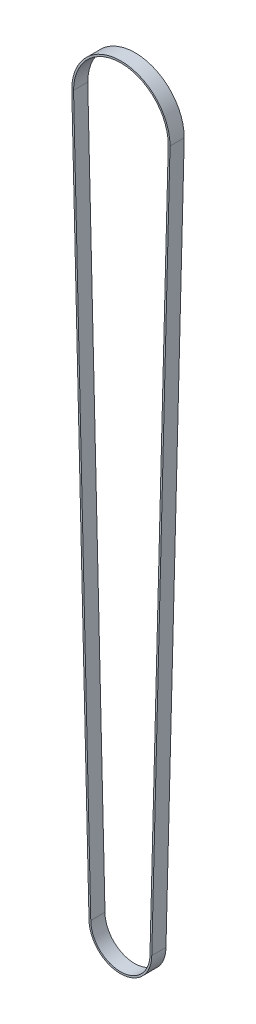
ISO-10303-21;
HEADER;
FILE_DESCRIPTION(('STEP AP214'),'2;1');
FILE_NAME('part.step','',(''),(''),'','','');
FILE_SCHEMA(('AUTOMOTIVE_DESIGN { 1 0 10303 214 1 1 1 1 }'));
ENDSEC;
DATA;
#1=APPLICATION_CONTEXT('core data for automotive mechanical design processes');
#2=APPLICATION_PROTOCOL_DEFINITION('international standard','automotive_design',2000,#1);
#3=PRODUCT_CONTEXT('',#1,'mechanical');
#4=PRODUCT('Part','Part','',(#3));
#5=PRODUCT_RELATED_PRODUCT_CATEGORY('part','',(#4));
#6=PRODUCT_DEFINITION_FORMATION('','',#4);
#7=PRODUCT_DEFINITION_CONTEXT('part definition',#1,'design');
#8=PRODUCT_DEFINITION('design','',#6,#7);
#9=PRODUCT_DEFINITION_SHAPE('','',#8);
#10=(LENGTH_UNIT() NAMED_UNIT(*) SI_UNIT(.MILLI.,.METRE.));
#11=(NAMED_UNIT(*) PLANE_ANGLE_UNIT() SI_UNIT($,.RADIAN.));
#12=(NAMED_UNIT(*) SI_UNIT($,.STERADIAN.) SOLID_ANGLE_UNIT());
#13=UNCERTAINTY_MEASURE_WITH_UNIT(LENGTH_MEASURE(1.E-05),#10,'distance_accuracy_value','');
#14=(GEOMETRIC_REPRESENTATION_CONTEXT(3) GLOBAL_UNCERTAINTY_ASSIGNED_CONTEXT((#13)) GLOBAL_UNIT_ASSIGNED_CONTEXT((#10,
#11,#12)) REPRESENTATION_CONTEXT('',''));
#15=CARTESIAN_POINT('',(0.,0.,0.));
#16=DIRECTION('',(0.,0.,1.));
#17=DIRECTION('',(1.,0.,0.));
#18=AXIS2_PLACEMENT_3D('',#15,#16,#17);
#19=CARTESIAN_POINT('',(-148.027890657385,409.394228907631,6.));
#20=DIRECTION('',(0.,0.,-1.));
#21=DIRECTION('',(-1.,0.,0.));
#22=AXIS2_PLACEMENT_3D('',#19,#20,#21);
#23=PLANE('',#22);
#24=CARTESIAN_POINT('',(-148.027890657385,409.394228907631,6.));
#25=DIRECTION('',(0.,0.,1.));
#26=DIRECTION('',(-1.,0.,0.));
#27=AXIS2_PLACEMENT_3D('',#24,#25,#26);
#28=CIRCLE('',#27,20.75);
#29=CARTESIAN_POINT('',(-127.277892941837,409.384492134822,6.));
#30=VERTEX_POINT('',#29);
#31=CARTESIAN_POINT('',(-168.777888625479,409.385046093184,6.));
#32=VERTEX_POINT('',#31);
#33=EDGE_CURVE('E140',#30,#32,#28,.T.);
#34=ORIENTED_EDGE('',*,*,#33,.T.);
#35=DIRECTION('',(0.0242606584120572,-0.999705666910723,0.));
#36=VECTOR('',#35,1.);
#37=CARTESIAN_POINT('',(-168.777888625479,409.385046093184,6.));
#38=LINE('',#37,#36);
#39=CARTESIAN_POINT('',(-161.497547072751,109.384997302637,6.));
#40=VERTEX_POINT('',#39);
#41=EDGE_CURVE('E143',#32,#40,#38,.T.);
#42=ORIENTED_EDGE('',*,*,#41,.T.);
#43=CARTESIAN_POINT('',(-148.247550288696,109.394228907631,6.));
#44=DIRECTION('',(0.,0.,1.));
#45=DIRECTION('',(-1.,0.,0.));
#46=AXIS2_PLACEMENT_3D('',#43,#44,#45);
#47=CIRCLE('',#46,13.25);
#48=CARTESIAN_POINT('',(-134.997553506784,109.38499422727,6.));
#49=VERTEX_POINT('',#48);
#50=EDGE_CURVE('E146',#40,#49,#47,.T.);
#51=ORIENTED_EDGE('',*,*,#50,.T.);
#52=DIRECTION('',(0.0257237298953508,0.999669090109458,0.));
#53=VECTOR('',#52,1.);
#54=CARTESIAN_POINT('',(-134.997553506784,109.38499422727,6.));
#55=LINE('',#54,#53);
#56=EDGE_CURVE('E148',#49,#30,#55,.T.);
#57=ORIENTED_EDGE('',*,*,#56,.T.);
#58=EDGE_LOOP('',(#34,#42,#51,#57));
#59=FACE_BOUND('',#58,.T.);
#60=CARTESIAN_POINT('',(-148.027890657385,409.394228907631,6.));
#61=DIRECTION('',(0.,0.,1.));
#62=DIRECTION('',(-1.,0.,0.));
#63=AXIS2_PLACEMENT_3D('',#60,#61,#62);
#64=CIRCLE('',#63,20.);
#65=CARTESIAN_POINT('',(-128.027890657385,409.394228907631,6.));
#66=VERTEX_POINT('',#65);
#67=CARTESIAN_POINT('',(-168.027890657385,409.394228907631,6.));
#68=VERTEX_POINT('',#67);
#69=EDGE_CURVE('E104',#66,#68,#64,.T.);
#70=ORIENTED_EDGE('',*,*,#69,.F.);
#71=DIRECTION('',(0.0257237298953509,0.999669090109458,0.));
#72=VECTOR('',#71,1.);
#73=CARTESIAN_POINT('',(-135.74755030027,109.394766833005,6.));
#74=LINE('',#73,#72);
#75=CARTESIAN_POINT('',(-135.74755030027,109.394766833005,6.));
#76=VERTEX_POINT('',#75);
#77=EDGE_CURVE('E126',#76,#66,#74,.T.);
#78=ORIENTED_EDGE('',*,*,#77,.F.);
#79=CARTESIAN_POINT('',(-148.247550288696,109.394228907631,6.));
#80=DIRECTION('',(0.,0.,1.));
#81=DIRECTION('',(-1.,0.,0.));
#82=AXIS2_PLACEMENT_3D('',#79,#80,#81);
#83=CIRCLE('',#82,12.5);
#84=CARTESIAN_POINT('',(-160.747550288696,109.394228907631,6.));
#85=VERTEX_POINT('',#84);
#86=EDGE_CURVE('E124',#85,#76,#83,.T.);
#87=ORIENTED_EDGE('',*,*,#86,.F.);
#88=DIRECTION('',(0.0242606584120572,-0.999705666910723,0.));
#89=VECTOR('',#88,1.);
#90=CARTESIAN_POINT('',(-168.027890657385,409.394228907631,6.));
#91=LINE('',#90,#89);
#92=EDGE_CURVE('E112',#68,#85,#91,.T.);
#93=ORIENTED_EDGE('',*,*,#92,.F.);
#94=EDGE_LOOP('',(#70,#78,#87,#93));
#95=FACE_BOUND('',#94,.T.);
#96=ADVANCED_FACE('F39',(#59,#95),#23,.F.);
#97=CARTESIAN_POINT('',(-148.027890657385,409.394228907631,0.));
#98=DIRECTION('',(0.,0.,-1.));
#99=DIRECTION('',(-1.,0.,0.));
#100=AXIS2_PLACEMENT_3D('',#97,#98,#99);
#101=PLANE('',#100);
#102=CARTESIAN_POINT('',(-148.027890657385,409.394228907631,0.));
#103=DIRECTION('',(0.,0.,1.));
#104=DIRECTION('',(-1.,0.,0.));
#105=AXIS2_PLACEMENT_3D('',#102,#103,#104);
#106=CIRCLE('',#105,20.75);
#107=CARTESIAN_POINT('',(-127.277892941837,409.384492134822,0.));
#108=VERTEX_POINT('',#107);
#109=CARTESIAN_POINT('',(-168.777888625479,409.385046093184,0.));
#110=VERTEX_POINT('',#109);
#111=EDGE_CURVE('E120',#108,#110,#106,.T.);
#112=ORIENTED_EDGE('',*,*,#111,.F.);
#113=DIRECTION('',(0.0257237298953508,0.999669090109458,0.));
#114=VECTOR('',#113,1.);
#115=CARTESIAN_POINT('',(-134.997553506784,109.38499422727,0.));
#116=LINE('',#115,#114);
#117=CARTESIAN_POINT('',(-134.997553506784,109.38499422727,0.));
#118=VERTEX_POINT('',#117);
#119=EDGE_CURVE('E144',#118,#108,#116,.T.);
#120=ORIENTED_EDGE('',*,*,#119,.F.);
#121=CARTESIAN_POINT('',(-148.247550288696,109.394228907631,0.));
#122=DIRECTION('',(0.,0.,1.));
#123=DIRECTION('',(-1.,0.,0.));
#124=AXIS2_PLACEMENT_3D('',#121,#122,#123);
#125=CIRCLE('',#124,13.25);
#126=CARTESIAN_POINT('',(-161.497547072751,109.384997302637,0.));
#127=VERTEX_POINT('',#126);
#128=EDGE_CURVE('E155',#127,#118,#125,.T.);
#129=ORIENTED_EDGE('',*,*,#128,.F.);
#130=DIRECTION('',(0.0242606584120572,-0.999705666910723,0.));
#131=VECTOR('',#130,1.);
#132=CARTESIAN_POINT('',(-168.777888625479,409.385046093184,0.));
#133=LINE('',#132,#131);
#134=EDGE_CURVE('E153',#110,#127,#133,.T.);
#135=ORIENTED_EDGE('',*,*,#134,.F.);
#136=EDGE_LOOP('',(#112,#120,#129,#135));
#137=FACE_BOUND('',#136,.T.);
#138=DIRECTION('',(0.0257237298953509,0.999669090109458,0.));
#139=VECTOR('',#138,1.);
#140=CARTESIAN_POINT('',(-135.74755030027,109.394766833005,0.));
#141=LINE('',#140,#139);
#142=CARTESIAN_POINT('',(-135.74755030027,109.394766833005,0.));
#143=VERTEX_POINT('',#142);
#144=CARTESIAN_POINT('',(-128.027890657385,409.394228907631,0.));
#145=VERTEX_POINT('',#144);
#146=EDGE_CURVE('E113',#143,#145,#141,.T.);
#147=ORIENTED_EDGE('',*,*,#146,.T.);
#148=CARTESIAN_POINT('',(-148.027890657385,409.394228907631,0.));
#149=DIRECTION('',(0.,0.,1.));
#150=DIRECTION('',(-1.,0.,0.));
#151=AXIS2_PLACEMENT_3D('',#148,#149,#150);
#152=CIRCLE('',#151,20.);
#153=CARTESIAN_POINT('',(-168.027890657385,409.394228907631,0.));
#154=VERTEX_POINT('',#153);
#155=EDGE_CURVE('E62',#145,#154,#152,.T.);
#156=ORIENTED_EDGE('',*,*,#155,.T.);
#157=DIRECTION('',(0.0242606584120572,-0.999705666910723,0.));
#158=VECTOR('',#157,1.);
#159=CARTESIAN_POINT('',(-168.027890657385,409.394228907631,0.));
#160=LINE('',#159,#158);
#161=CARTESIAN_POINT('',(-160.747550288696,109.394228907631,0.));
#162=VERTEX_POINT('',#161);
#163=EDGE_CURVE('E119',#154,#162,#160,.T.);
#164=ORIENTED_EDGE('',*,*,#163,.T.);
#165=CARTESIAN_POINT('',(-148.247550288696,109.394228907631,0.));
#166=DIRECTION('',(0.,0.,1.));
#167=DIRECTION('',(-1.,0.,0.));
#168=AXIS2_PLACEMENT_3D('',#165,#166,#167);
#169=CIRCLE('',#168,12.5);
#170=EDGE_CURVE('E132',#162,#143,#169,.T.);
#171=ORIENTED_EDGE('',*,*,#170,.T.);
#172=EDGE_LOOP('',(#147,#156,#164,#171));
#173=FACE_BOUND('',#172,.T.);
#174=ADVANCED_FACE('F173',(#137,#173),#101,.T.);
#175=CARTESIAN_POINT('',(-148.027890657385,409.394228907631,6.));
#176=DIRECTION('',(0.,0.,-1.));
#177=DIRECTION('',(-1.,0.,0.));
#178=AXIS2_PLACEMENT_3D('',#175,#176,#177);
#179=CYLINDRICAL_SURFACE('',#178,20.75);
#180=ORIENTED_EDGE('',*,*,#111,.T.);
#181=DIRECTION('',(0.,0.,-1.));
#182=VECTOR('',#181,1.);
#183=CARTESIAN_POINT('',(-168.777888625479,409.385046093184,6.));
#184=LINE('',#183,#182);
#185=EDGE_CURVE('E11',#32,#110,#184,.T.);
#186=ORIENTED_EDGE('',*,*,#185,.F.);
#187=ORIENTED_EDGE('',*,*,#33,.F.);
#188=DIRECTION('',(0.,0.,-1.));
#189=VECTOR('',#188,1.);
#190=CARTESIAN_POINT('',(-127.277892941837,409.384492134822,6.));
#191=LINE('',#190,#189);
#192=EDGE_CURVE('E150',#30,#108,#191,.T.);
#193=ORIENTED_EDGE('',*,*,#192,.T.);
#194=EDGE_LOOP('',(#180,#186,#187,#193));
#195=FACE_BOUND('',#194,.T.);
#196=ADVANCED_FACE('F41',(#195),#179,.T.);
#197=CARTESIAN_POINT('',(-168.777888625479,409.385046093184,6.));
#198=DIRECTION('',(0.999705666910723,0.0242606584120572,0.));
#199=DIRECTION('',(-0.0242606584120572,0.999705666910723,0.));
#200=AXIS2_PLACEMENT_3D('',#197,#198,#199);
#201=PLANE('',#200);
#202=ORIENTED_EDGE('',*,*,#134,.T.);
#203=DIRECTION('',(0.,0.,-1.));
#204=VECTOR('',#203,1.);
#205=CARTESIAN_POINT('',(-161.497547072751,109.384997302637,6.));
#206=LINE('',#205,#204);
#207=EDGE_CURVE('E47',#40,#127,#206,.T.);
#208=ORIENTED_EDGE('',*,*,#207,.F.);
#209=ORIENTED_EDGE('',*,*,#41,.F.);
#210=ORIENTED_EDGE('',*,*,#185,.T.);
#211=EDGE_LOOP('',(#202,#208,#209,#210));
#212=FACE_BOUND('',#211,.T.);
#213=ADVANCED_FACE('F183',(#212),#201,.F.);
#214=CARTESIAN_POINT('',(-148.247550288696,109.394228907631,6.));
#215=DIRECTION('',(0.,0.,-1.));
#216=DIRECTION('',(-1.,0.,0.));
#217=AXIS2_PLACEMENT_3D('',#214,#215,#216);
#218=CYLINDRICAL_SURFACE('',#217,13.25);
#219=ORIENTED_EDGE('',*,*,#128,.T.);
#220=DIRECTION('',(0.,0.,-1.));
#221=VECTOR('',#220,1.);
#222=CARTESIAN_POINT('',(-134.997553506784,109.38499422727,6.));
#223=LINE('',#222,#221);
#224=EDGE_CURVE('E160',#49,#118,#223,.T.);
#225=ORIENTED_EDGE('',*,*,#224,.F.);
#226=ORIENTED_EDGE('',*,*,#50,.F.);
#227=ORIENTED_EDGE('',*,*,#207,.T.);
#228=EDGE_LOOP('',(#219,#225,#226,#227));
#229=FACE_BOUND('',#228,.T.);
#230=ADVANCED_FACE('F167',(#229),#218,.T.);
#231=CARTESIAN_POINT('',(-134.997553506784,109.38499422727,6.));
#232=DIRECTION('',(-0.999669090109458,0.0257237298953508,0.));
#233=DIRECTION('',(-0.0257237298953508,-0.999669090109458,0.));
#234=AXIS2_PLACEMENT_3D('',#231,#232,#233);
#235=PLANE('',#234);
#236=ORIENTED_EDGE('',*,*,#119,.T.);
#237=ORIENTED_EDGE('',*,*,#192,.F.);
#238=ORIENTED_EDGE('',*,*,#56,.F.);
#239=ORIENTED_EDGE('',*,*,#224,.T.);
#240=EDGE_LOOP('',(#236,#237,#238,#239));
#241=FACE_BOUND('',#240,.T.);
#242=ADVANCED_FACE('F177',(#241),#235,.F.);
#243=CARTESIAN_POINT('',(-148.027890657385,409.394228907631,6.));
#244=DIRECTION('',(0.,0.,-1.));
#245=DIRECTION('',(-1.,0.,0.));
#246=AXIS2_PLACEMENT_3D('',#243,#244,#245);
#247=CYLINDRICAL_SURFACE('',#246,20.);
#248=ORIENTED_EDGE('',*,*,#155,.F.);
#249=DIRECTION('',(0.,0.,-1.));
#250=VECTOR('',#249,1.);
#251=CARTESIAN_POINT('',(-128.027890657385,409.394228907631,6.));
#252=LINE('',#251,#250);
#253=EDGE_CURVE('E108',#66,#145,#252,.T.);
#254=ORIENTED_EDGE('',*,*,#253,.F.);
#255=ORIENTED_EDGE('',*,*,#69,.T.);
#256=DIRECTION('',(0.,0.,-1.));
#257=VECTOR('',#256,1.);
#258=CARTESIAN_POINT('',(-168.027890657385,409.394228907631,6.));
#259=LINE('',#258,#257);
#260=EDGE_CURVE('E107',#68,#154,#259,.T.);
#261=ORIENTED_EDGE('',*,*,#260,.T.);
#262=EDGE_LOOP('',(#248,#254,#255,#261));
#263=FACE_BOUND('',#262,.T.);
#264=ADVANCED_FACE('F106',(#263),#247,.F.);
#265=CARTESIAN_POINT('',(-168.027890657385,409.394228907631,6.));
#266=DIRECTION('',(0.999705666910723,0.0242606584120572,0.));
#267=DIRECTION('',(-0.0242606584120572,0.999705666910723,0.));
#268=AXIS2_PLACEMENT_3D('',#265,#266,#267);
#269=PLANE('',#268);
#270=ORIENTED_EDGE('',*,*,#163,.F.);
#271=ORIENTED_EDGE('',*,*,#260,.F.);
#272=ORIENTED_EDGE('',*,*,#92,.T.);
#273=DIRECTION('',(0.,0.,-1.));
#274=VECTOR('',#273,1.);
#275=CARTESIAN_POINT('',(-160.747550288696,109.394228907631,6.));
#276=LINE('',#275,#274);
#277=EDGE_CURVE('E121',#85,#162,#276,.T.);
#278=ORIENTED_EDGE('',*,*,#277,.T.);
#279=EDGE_LOOP('',(#270,#271,#272,#278));
#280=FACE_BOUND('',#279,.T.);
#281=ADVANCED_FACE('F116',(#280),#269,.T.);
#282=CARTESIAN_POINT('',(-148.247550288696,109.394228907631,6.));
#283=DIRECTION('',(0.,0.,-1.));
#284=DIRECTION('',(-1.,0.,0.));
#285=AXIS2_PLACEMENT_3D('',#282,#283,#284);
#286=CYLINDRICAL_SURFACE('',#285,12.5);
#287=ORIENTED_EDGE('',*,*,#170,.F.);
#288=ORIENTED_EDGE('',*,*,#277,.F.);
#289=ORIENTED_EDGE('',*,*,#86,.T.);
#290=DIRECTION('',(0.,0.,-1.));
#291=VECTOR('',#290,1.);
#292=CARTESIAN_POINT('',(-135.74755030027,109.394766833005,6.));
#293=LINE('',#292,#291);
#294=EDGE_CURVE('E54',#76,#143,#293,.T.);
#295=ORIENTED_EDGE('',*,*,#294,.T.);
#296=EDGE_LOOP('',(#287,#288,#289,#295));
#297=FACE_BOUND('',#296,.T.);
#298=ADVANCED_FACE('F206',(#297),#286,.F.);
#299=CARTESIAN_POINT('',(-135.74755030027,109.394766833005,6.));
#300=DIRECTION('',(-0.999669090109458,0.0257237298953509,0.));
#301=DIRECTION('',(-0.0257237298953509,-0.999669090109458,0.));
#302=AXIS2_PLACEMENT_3D('',#299,#300,#301);
#303=PLANE('',#302);
#304=ORIENTED_EDGE('',*,*,#146,.F.);
#305=ORIENTED_EDGE('',*,*,#294,.F.);
#306=ORIENTED_EDGE('',*,*,#77,.T.);
#307=ORIENTED_EDGE('',*,*,#253,.T.);
#308=EDGE_LOOP('',(#304,#305,#306,#307));
#309=FACE_BOUND('',#308,.T.);
#310=ADVANCED_FACE('F210',(#309),#303,.T.);
#311=CLOSED_SHELL('',(#96,#174,#196,#213,#230,#242,#264,#281,#298,#310));
#312=MANIFOLD_SOLID_BREP('B2',#311);
#313=ADVANCED_BREP_SHAPE_REPRESENTATION('',(#18,#312),#14);
#314=SHAPE_DEFINITION_REPRESENTATION(#9,#313);
ENDSEC;
END-ISO-10303-21;
